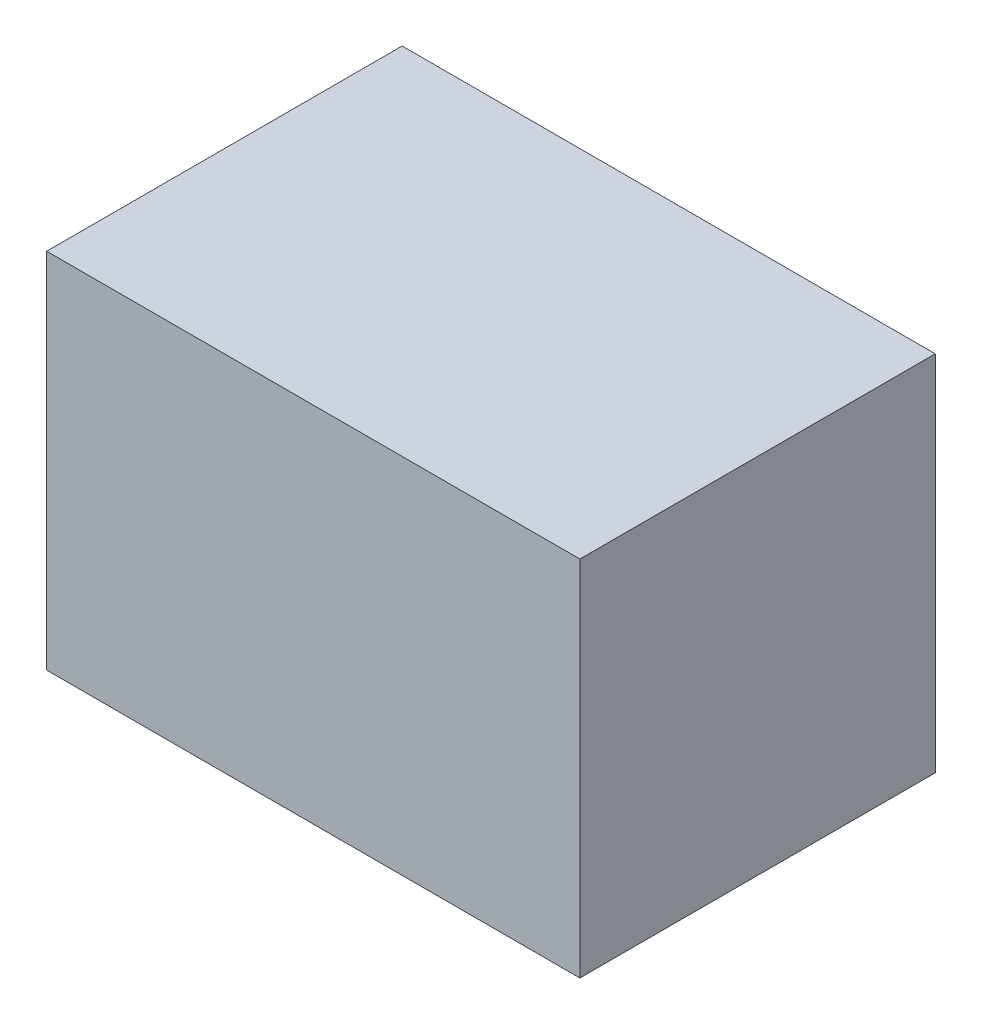
ISO-10303-21;
HEADER;
FILE_DESCRIPTION(('STEP AP214'),'2;1');
FILE_NAME('part.step','',(''),(''),'','','');
FILE_SCHEMA(('AUTOMOTIVE_DESIGN { 1 0 10303 214 1 1 1 1 }'));
ENDSEC;
DATA;
#1=APPLICATION_CONTEXT('core data for automotive mechanical design processes');
#2=APPLICATION_PROTOCOL_DEFINITION('international standard','automotive_design',2000,#1);
#3=PRODUCT_CONTEXT('',#1,'mechanical');
#4=PRODUCT('Part','Part','',(#3));
#5=PRODUCT_RELATED_PRODUCT_CATEGORY('part','',(#4));
#6=PRODUCT_DEFINITION_FORMATION('','',#4);
#7=PRODUCT_DEFINITION_CONTEXT('part definition',#1,'design');
#8=PRODUCT_DEFINITION('design','',#6,#7);
#9=PRODUCT_DEFINITION_SHAPE('','',#8);
#10=(LENGTH_UNIT() NAMED_UNIT(*) SI_UNIT(.MILLI.,.METRE.));
#11=(NAMED_UNIT(*) PLANE_ANGLE_UNIT() SI_UNIT($,.RADIAN.));
#12=(NAMED_UNIT(*) SI_UNIT($,.STERADIAN.) SOLID_ANGLE_UNIT());
#13=UNCERTAINTY_MEASURE_WITH_UNIT(LENGTH_MEASURE(1.E-05),#10,'distance_accuracy_value','');
#14=(GEOMETRIC_REPRESENTATION_CONTEXT(3) GLOBAL_UNCERTAINTY_ASSIGNED_CONTEXT((#13)) GLOBAL_UNIT_ASSIGNED_CONTEXT((#10,
#11,#12)) REPRESENTATION_CONTEXT('',''));
#15=CARTESIAN_POINT('',(0.,0.,0.));
#16=DIRECTION('',(0.,0.,1.));
#17=DIRECTION('',(1.,0.,0.));
#18=AXIS2_PLACEMENT_3D('',#15,#16,#17);
#19=CARTESIAN_POINT('',(-36.,24.5,24.));
#20=DIRECTION('',(1.,0.,0.));
#21=DIRECTION('',(0.,0.,-1.));
#22=AXIS2_PLACEMENT_3D('',#19,#20,#21);
#23=PLANE('',#22);
#24=DIRECTION('',(0.,0.,1.));
#25=VECTOR('',#24,1.);
#26=CARTESIAN_POINT('',(-36.,-24.5,24.));
#27=LINE('',#26,#25);
#28=CARTESIAN_POINT('',(-36.,-24.5,-24.));
#29=VERTEX_POINT('',#28);
#30=CARTESIAN_POINT('',(-36.,-24.5,24.));
#31=VERTEX_POINT('',#30);
#32=EDGE_CURVE('E95',#29,#31,#27,.T.);
#33=ORIENTED_EDGE('',*,*,#32,.T.);
#34=DIRECTION('',(0.,-1.,0.));
#35=VECTOR('',#34,1.);
#36=CARTESIAN_POINT('',(-36.,24.5,24.));
#37=LINE('',#36,#35);
#38=CARTESIAN_POINT('',(-36.,24.5,24.));
#39=VERTEX_POINT('',#38);
#40=EDGE_CURVE('E11',#39,#31,#37,.T.);
#41=ORIENTED_EDGE('',*,*,#40,.F.);
#42=DIRECTION('',(0.,0.,1.));
#43=VECTOR('',#42,1.);
#44=CARTESIAN_POINT('',(-36.,24.5,24.));
#45=LINE('',#44,#43);
#46=CARTESIAN_POINT('',(-36.,24.5,-24.));
#47=VERTEX_POINT('',#46);
#48=EDGE_CURVE('E83',#47,#39,#45,.T.);
#49=ORIENTED_EDGE('',*,*,#48,.F.);
#50=DIRECTION('',(0.,-1.,0.));
#51=VECTOR('',#50,1.);
#52=CARTESIAN_POINT('',(-36.,24.5,-24.));
#53=LINE('',#52,#51);
#54=EDGE_CURVE('E91',#47,#29,#53,.T.);
#55=ORIENTED_EDGE('',*,*,#54,.T.);
#56=EDGE_LOOP('',(#33,#41,#49,#55));
#57=FACE_BOUND('',#56,.T.);
#58=ADVANCED_FACE('F32',(#57),#23,.F.);
#59=CARTESIAN_POINT('',(36.,24.5,24.));
#60=DIRECTION('',(0.,0.,-1.));
#61=DIRECTION('',(-1.,0.,0.));
#62=AXIS2_PLACEMENT_3D('',#59,#60,#61);
#63=PLANE('',#62);
#64=DIRECTION('',(1.,0.,0.));
#65=VECTOR('',#64,1.);
#66=CARTESIAN_POINT('',(36.,-24.5,24.));
#67=LINE('',#66,#65);
#68=CARTESIAN_POINT('',(36.,-24.5,24.));
#69=VERTEX_POINT('',#68);
#70=EDGE_CURVE('E87',#31,#69,#67,.T.);
#71=ORIENTED_EDGE('',*,*,#70,.T.);
#72=DIRECTION('',(0.,-1.,0.));
#73=VECTOR('',#72,1.);
#74=CARTESIAN_POINT('',(36.,24.5,24.));
#75=LINE('',#74,#73);
#76=CARTESIAN_POINT('',(36.,24.5,24.));
#77=VERTEX_POINT('',#76);
#78=EDGE_CURVE('E40',#77,#69,#75,.T.);
#79=ORIENTED_EDGE('',*,*,#78,.F.);
#80=DIRECTION('',(1.,0.,0.));
#81=VECTOR('',#80,1.);
#82=CARTESIAN_POINT('',(36.,24.5,24.));
#83=LINE('',#82,#81);
#84=EDGE_CURVE('E78',#39,#77,#83,.T.);
#85=ORIENTED_EDGE('',*,*,#84,.F.);
#86=ORIENTED_EDGE('',*,*,#40,.T.);
#87=EDGE_LOOP('',(#71,#79,#85,#86));
#88=FACE_BOUND('',#87,.T.);
#89=ADVANCED_FACE('F86',(#88),#63,.F.);
#90=CARTESIAN_POINT('',(36.,24.5,24.));
#91=DIRECTION('',(-1.,0.,0.));
#92=DIRECTION('',(0.,0.,1.));
#93=AXIS2_PLACEMENT_3D('',#90,#91,#92);
#94=PLANE('',#93);
#95=DIRECTION('',(0.,0.,-1.));
#96=VECTOR('',#95,1.);
#97=CARTESIAN_POINT('',(36.,-24.5,24.));
#98=LINE('',#97,#96);
#99=CARTESIAN_POINT('',(36.,-24.5,-24.));
#100=VERTEX_POINT('',#99);
#101=EDGE_CURVE('E65',#69,#100,#98,.T.);
#102=ORIENTED_EDGE('',*,*,#101,.T.);
#103=DIRECTION('',(0.,-1.,0.));
#104=VECTOR('',#103,1.);
#105=CARTESIAN_POINT('',(36.,24.5,-24.));
#106=LINE('',#105,#104);
#107=CARTESIAN_POINT('',(36.,24.5,-24.));
#108=VERTEX_POINT('',#107);
#109=EDGE_CURVE('E88',#108,#100,#106,.T.);
#110=ORIENTED_EDGE('',*,*,#109,.F.);
#111=DIRECTION('',(0.,0.,-1.));
#112=VECTOR('',#111,1.);
#113=CARTESIAN_POINT('',(36.,24.5,24.));
#114=LINE('',#113,#112);
#115=EDGE_CURVE('E81',#77,#108,#114,.T.);
#116=ORIENTED_EDGE('',*,*,#115,.F.);
#117=ORIENTED_EDGE('',*,*,#78,.T.);
#118=EDGE_LOOP('',(#102,#110,#116,#117));
#119=FACE_BOUND('',#118,.T.);
#120=ADVANCED_FACE('F89',(#119),#94,.F.);
#121=CARTESIAN_POINT('',(36.,24.5,-24.));
#122=DIRECTION('',(0.,0.,1.));
#123=DIRECTION('',(1.,0.,0.));
#124=AXIS2_PLACEMENT_3D('',#121,#122,#123);
#125=PLANE('',#124);
#126=DIRECTION('',(-1.,0.,0.));
#127=VECTOR('',#126,1.);
#128=CARTESIAN_POINT('',(36.,-24.5,-24.));
#129=LINE('',#128,#127);
#130=EDGE_CURVE('E71',#100,#29,#129,.T.);
#131=ORIENTED_EDGE('',*,*,#130,.T.);
#132=ORIENTED_EDGE('',*,*,#54,.F.);
#133=DIRECTION('',(-1.,0.,0.));
#134=VECTOR('',#133,1.);
#135=CARTESIAN_POINT('',(36.,24.5,-24.));
#136=LINE('',#135,#134);
#137=EDGE_CURVE('E48',#108,#47,#136,.T.);
#138=ORIENTED_EDGE('',*,*,#137,.F.);
#139=ORIENTED_EDGE('',*,*,#109,.T.);
#140=EDGE_LOOP('',(#131,#132,#138,#139));
#141=FACE_BOUND('',#140,.T.);
#142=ADVANCED_FACE('F102',(#141),#125,.F.);
#143=CARTESIAN_POINT('',(0.,24.5,0.));
#144=DIRECTION('',(0.,1.,0.));
#145=DIRECTION('',(0.,0.,1.));
#146=AXIS2_PLACEMENT_3D('',#143,#144,#145);
#147=PLANE('',#146);
#148=ORIENTED_EDGE('',*,*,#48,.T.);
#149=ORIENTED_EDGE('',*,*,#84,.T.);
#150=ORIENTED_EDGE('',*,*,#115,.T.);
#151=ORIENTED_EDGE('',*,*,#137,.T.);
#152=EDGE_LOOP('',(#148,#149,#150,#151));
#153=FACE_BOUND('',#152,.T.);
#154=ADVANCED_FACE('F79',(#153),#147,.T.);
#155=CARTESIAN_POINT('',(0.,-24.5,0.));
#156=DIRECTION('',(0.,1.,0.));
#157=DIRECTION('',(0.,0.,1.));
#158=AXIS2_PLACEMENT_3D('',#155,#156,#157);
#159=PLANE('',#158);
#160=ORIENTED_EDGE('',*,*,#32,.F.);
#161=ORIENTED_EDGE('',*,*,#130,.F.);
#162=ORIENTED_EDGE('',*,*,#101,.F.);
#163=ORIENTED_EDGE('',*,*,#70,.F.);
#164=EDGE_LOOP('',(#160,#161,#162,#163));
#165=FACE_BOUND('',#164,.T.);
#166=ADVANCED_FACE('F105',(#165),#159,.F.);
#167=CLOSED_SHELL('',(#58,#89,#120,#142,#154,#166));
#168=MANIFOLD_SOLID_BREP('B2',#167);
#169=ADVANCED_BREP_SHAPE_REPRESENTATION('',(#18,#168),#14);
#170=SHAPE_DEFINITION_REPRESENTATION(#9,#169);
ENDSEC;
END-ISO-10303-21;
